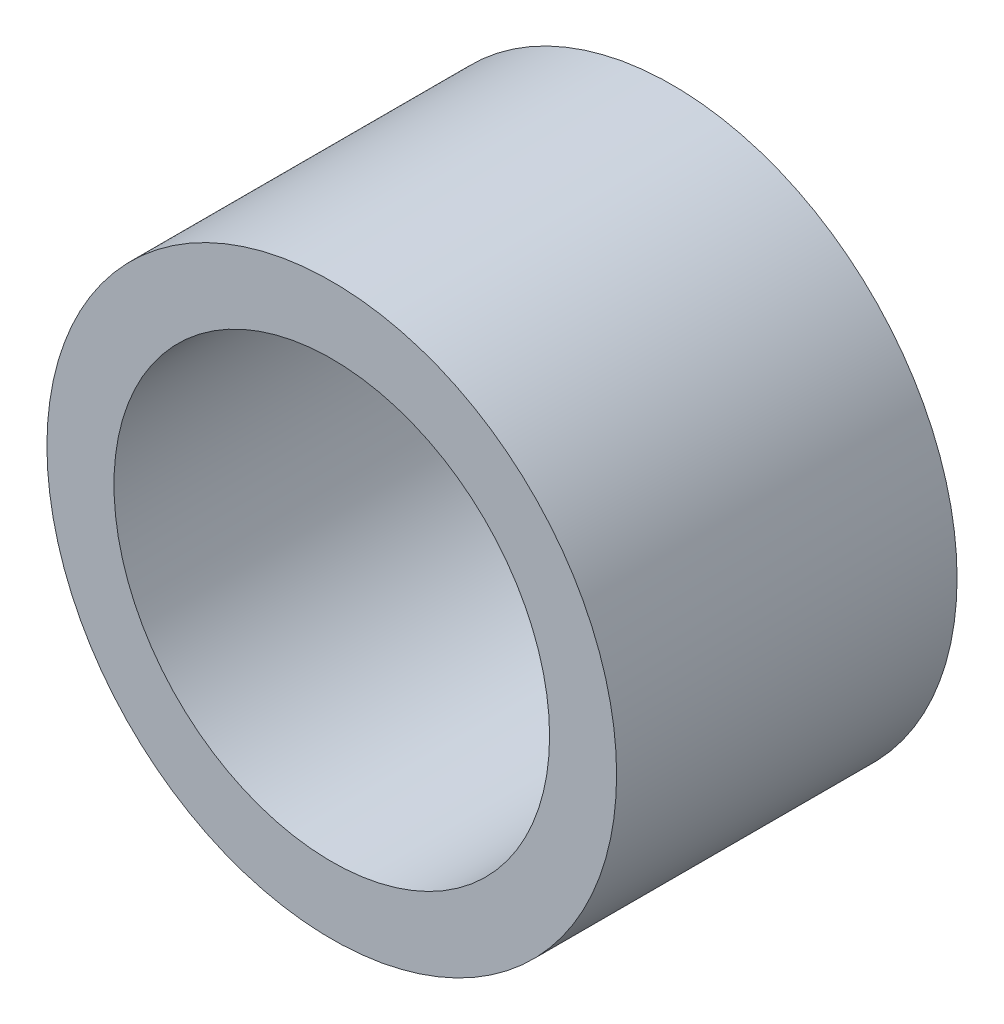
ISO-10303-21;
HEADER;
FILE_DESCRIPTION(('STEP AP214'),'2;1');
FILE_NAME('part.step','',(''),(''),'','','');
FILE_SCHEMA(('AUTOMOTIVE_DESIGN { 1 0 10303 214 1 1 1 1 }'));
ENDSEC;
DATA;
#1=APPLICATION_CONTEXT('core data for automotive mechanical design processes');
#2=APPLICATION_PROTOCOL_DEFINITION('international standard','automotive_design',2000,#1);
#3=PRODUCT_CONTEXT('',#1,'mechanical');
#4=PRODUCT('Part','Part','',(#3));
#5=PRODUCT_RELATED_PRODUCT_CATEGORY('part','',(#4));
#6=PRODUCT_DEFINITION_FORMATION('','',#4);
#7=PRODUCT_DEFINITION_CONTEXT('part definition',#1,'design');
#8=PRODUCT_DEFINITION('design','',#6,#7);
#9=PRODUCT_DEFINITION_SHAPE('','',#8);
#10=(LENGTH_UNIT() NAMED_UNIT(*) SI_UNIT(.MILLI.,.METRE.));
#11=(NAMED_UNIT(*) PLANE_ANGLE_UNIT() SI_UNIT($,.RADIAN.));
#12=(NAMED_UNIT(*) SI_UNIT($,.STERADIAN.) SOLID_ANGLE_UNIT());
#13=UNCERTAINTY_MEASURE_WITH_UNIT(LENGTH_MEASURE(1.E-05),#10,'distance_accuracy_value','');
#14=(GEOMETRIC_REPRESENTATION_CONTEXT(3) GLOBAL_UNCERTAINTY_ASSIGNED_CONTEXT((#13)) GLOBAL_UNIT_ASSIGNED_CONTEXT((#10,
#11,#12)) REPRESENTATION_CONTEXT('',''));
#15=CARTESIAN_POINT('',(0.,0.,0.));
#16=DIRECTION('',(0.,0.,1.));
#17=DIRECTION('',(1.,0.,0.));
#18=AXIS2_PLACEMENT_3D('',#15,#16,#17);
#19=CARTESIAN_POINT('',(0.,0.,5.08));
#20=DIRECTION('',(0.,0.,1.));
#21=DIRECTION('',(1.,0.,0.));
#22=AXIS2_PLACEMENT_3D('',#19,#20,#21);
#23=PLANE('',#22);
#24=CARTESIAN_POINT('',(0.,0.,5.08));
#25=DIRECTION('',(0.,0.,1.));
#26=DIRECTION('',(1.,0.,0.));
#27=AXIS2_PLACEMENT_3D('',#24,#25,#26);
#28=CIRCLE('',#27,4.25);
#29=CARTESIAN_POINT('',(4.25,0.,5.08));
#30=VERTEX_POINT('',#29);
#31=EDGE_CURVE('E10',#30,#30,#28,.T.);
#32=ORIENTED_EDGE('',*,*,#31,.T.);
#33=EDGE_LOOP('',(#32));
#34=FACE_BOUND('',#33,.T.);
#35=CARTESIAN_POINT('',(0.,0.,5.08));
#36=DIRECTION('',(0.,0.,1.));
#37=DIRECTION('',(1.,0.,0.));
#38=AXIS2_PLACEMENT_3D('',#35,#36,#37);
#39=CIRCLE('',#38,3.25);
#40=CARTESIAN_POINT('',(3.25,0.,5.08));
#41=VERTEX_POINT('',#40);
#42=EDGE_CURVE('E46',#41,#41,#39,.T.);
#43=ORIENTED_EDGE('',*,*,#42,.F.);
#44=EDGE_LOOP('',(#43));
#45=FACE_BOUND('',#44,.T.);
#46=ADVANCED_FACE('F35',(#34,#45),#23,.T.);
#47=CARTESIAN_POINT('',(0.,0.,0.));
#48=DIRECTION('',(0.,0.,1.));
#49=DIRECTION('',(1.,0.,0.));
#50=AXIS2_PLACEMENT_3D('',#47,#48,#49);
#51=PLANE('',#50);
#52=CARTESIAN_POINT('',(0.,0.,0.));
#53=DIRECTION('',(0.,0.,1.));
#54=DIRECTION('',(1.,0.,0.));
#55=AXIS2_PLACEMENT_3D('',#52,#53,#54);
#56=CIRCLE('',#55,4.25);
#57=CARTESIAN_POINT('',(4.25,0.,0.));
#58=VERTEX_POINT('',#57);
#59=EDGE_CURVE('E39',#58,#58,#56,.T.);
#60=ORIENTED_EDGE('',*,*,#59,.F.);
#61=EDGE_LOOP('',(#60));
#62=FACE_BOUND('',#61,.T.);
#63=CARTESIAN_POINT('',(0.,0.,0.));
#64=DIRECTION('',(0.,0.,1.));
#65=DIRECTION('',(1.,0.,0.));
#66=AXIS2_PLACEMENT_3D('',#63,#64,#65);
#67=CIRCLE('',#66,3.25);
#68=CARTESIAN_POINT('',(3.25,0.,0.));
#69=VERTEX_POINT('',#68);
#70=EDGE_CURVE('E48',#69,#69,#67,.T.);
#71=ORIENTED_EDGE('',*,*,#70,.T.);
#72=EDGE_LOOP('',(#71));
#73=FACE_BOUND('',#72,.T.);
#74=ADVANCED_FACE('F58',(#62,#73),#51,.F.);
#75=CARTESIAN_POINT('',(0.,0.,5.08));
#76=DIRECTION('',(0.,0.,-1.));
#77=DIRECTION('',(-1.,0.,0.));
#78=AXIS2_PLACEMENT_3D('',#75,#76,#77);
#79=CYLINDRICAL_SURFACE('',#78,4.25);
#80=ORIENTED_EDGE('',*,*,#31,.F.);
#81=EDGE_LOOP('',(#80));
#82=FACE_BOUND('',#81,.T.);
#83=ORIENTED_EDGE('',*,*,#59,.T.);
#84=EDGE_LOOP('',(#83));
#85=FACE_BOUND('',#84,.T.);
#86=ADVANCED_FACE('F37',(#82,#85),#79,.T.);
#87=CARTESIAN_POINT('',(0.,0.,5.08));
#88=DIRECTION('',(0.,0.,-1.));
#89=DIRECTION('',(-1.,0.,0.));
#90=AXIS2_PLACEMENT_3D('',#87,#88,#89);
#91=CYLINDRICAL_SURFACE('',#90,3.25);
#92=ORIENTED_EDGE('',*,*,#42,.T.);
#93=EDGE_LOOP('',(#92));
#94=FACE_BOUND('',#93,.T.);
#95=ORIENTED_EDGE('',*,*,#70,.F.);
#96=EDGE_LOOP('',(#95));
#97=FACE_BOUND('',#96,.T.);
#98=ADVANCED_FACE('F54',(#94,#97),#91,.F.);
#99=CLOSED_SHELL('',(#46,#74,#86,#98));
#100=MANIFOLD_SOLID_BREP('B2',#99);
#101=ADVANCED_BREP_SHAPE_REPRESENTATION('',(#18,#100),#14);
#102=SHAPE_DEFINITION_REPRESENTATION(#9,#101);
ENDSEC;
END-ISO-10303-21;
